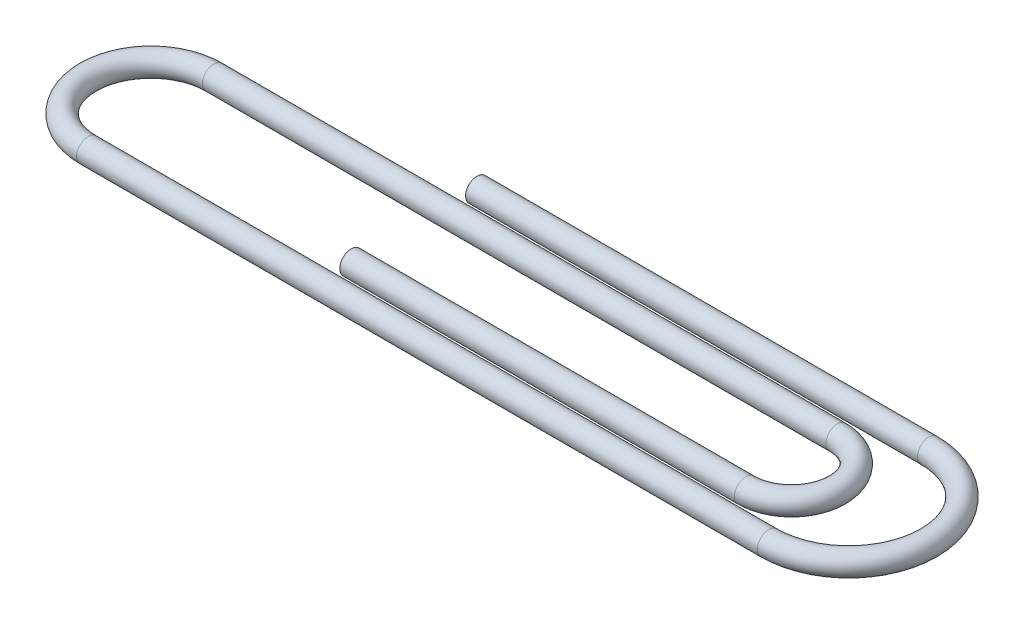
ISO-10303-21;
HEADER;
FILE_DESCRIPTION(('STEP AP214'),'2;1');
FILE_NAME('part.step','',(''),(''),'','','');
FILE_SCHEMA(('AUTOMOTIVE_DESIGN { 1 0 10303 214 1 1 1 1 }'));
ENDSEC;
DATA;
#1=APPLICATION_CONTEXT('core data for automotive mechanical design processes');
#2=APPLICATION_PROTOCOL_DEFINITION('international standard','automotive_design',2000,#1);
#3=PRODUCT_CONTEXT('',#1,'mechanical');
#4=PRODUCT('Part','Part','',(#3));
#5=PRODUCT_RELATED_PRODUCT_CATEGORY('part','',(#4));
#6=PRODUCT_DEFINITION_FORMATION('','',#4);
#7=PRODUCT_DEFINITION_CONTEXT('part definition',#1,'design');
#8=PRODUCT_DEFINITION('design','',#6,#7);
#9=PRODUCT_DEFINITION_SHAPE('','',#8);
#10=(LENGTH_UNIT() NAMED_UNIT(*) SI_UNIT(.MILLI.,.METRE.));
#11=(NAMED_UNIT(*) PLANE_ANGLE_UNIT() SI_UNIT($,.RADIAN.));
#12=(NAMED_UNIT(*) SI_UNIT($,.STERADIAN.) SOLID_ANGLE_UNIT());
#13=UNCERTAINTY_MEASURE_WITH_UNIT(LENGTH_MEASURE(1.E-05),#10,'distance_accuracy_value','');
#14=(GEOMETRIC_REPRESENTATION_CONTEXT(3) GLOBAL_UNCERTAINTY_ASSIGNED_CONTEXT((#13)) GLOBAL_UNIT_ASSIGNED_CONTEXT((#10,
#11,#12)) REPRESENTATION_CONTEXT('',''));
#15=CARTESIAN_POINT('',(0.,0.,0.));
#16=DIRECTION('',(0.,0.,1.));
#17=DIRECTION('',(1.,0.,0.));
#18=AXIS2_PLACEMENT_3D('',#15,#16,#17);
#19=CARTESIAN_POINT('',(0.,0.,0.));
#20=DIRECTION('',(-1.,0.,0.));
#21=DIRECTION('',(0.,0.,1.));
#22=AXIS2_PLACEMENT_3D('',#19,#20,#21);
#23=PLANE('',#22);
#24=CARTESIAN_POINT('',(0.,0.,0.));
#25=DIRECTION('',(-1.,0.,0.));
#26=DIRECTION('',(0.,0.,1.));
#27=AXIS2_PLACEMENT_3D('',#24,#25,#26);
#28=CIRCLE('',#27,0.5);
#29=CARTESIAN_POINT('',(0.,0.,0.5));
#30=VERTEX_POINT('',#29);
#31=EDGE_CURVE('E90',#30,#30,#28,.T.);
#32=ORIENTED_EDGE('',*,*,#31,.T.);
#33=EDGE_LOOP('',(#32));
#34=FACE_BOUND('',#33,.T.);
#35=ADVANCED_FACE('F55',(#34),#23,.T.);
#36=CARTESIAN_POINT('',(0.,0.,5.5));
#37=DIRECTION('',(1.,0.,0.));
#38=DIRECTION('',(0.,0.,-1.));
#39=AXIS2_PLACEMENT_3D('',#36,#37,#38);
#40=PLANE('',#39);
#41=CARTESIAN_POINT('',(0.,0.,5.5));
#42=DIRECTION('',(1.,0.,0.));
#43=DIRECTION('',(0.,0.,-1.));
#44=AXIS2_PLACEMENT_3D('',#41,#42,#43);
#45=CIRCLE('',#44,0.5);
#46=CARTESIAN_POINT('',(0.,0.,5.));
#47=VERTEX_POINT('',#46);
#48=EDGE_CURVE('E11',#47,#47,#45,.T.);
#49=ORIENTED_EDGE('',*,*,#48,.F.);
#50=EDGE_LOOP('',(#49));
#51=FACE_BOUND('',#50,.T.);
#52=ADVANCED_FACE('F99',(#51),#40,.F.);
#53=CARTESIAN_POINT('',(0.,0.,0.));
#54=DIRECTION('',(1.,0.,0.));
#55=DIRECTION('',(0.,0.,-1.));
#56=AXIS2_PLACEMENT_3D('',#53,#54,#55);
#57=CYLINDRICAL_SURFACE('',#56,0.5);
#58=CARTESIAN_POINT('',(19.75,0.,0.));
#59=DIRECTION('',(-1.,0.,0.));
#60=DIRECTION('',(0.,0.,1.));
#61=AXIS2_PLACEMENT_3D('',#58,#59,#60);
#62=CIRCLE('',#61,0.5);
#63=CARTESIAN_POINT('',(19.75,0.,-0.5));
#64=VERTEX_POINT('',#63);
#65=EDGE_CURVE('E86',#64,#64,#62,.T.);
#66=ORIENTED_EDGE('',*,*,#65,.T.);
#67=EDGE_LOOP('',(#66));
#68=FACE_BOUND('',#67,.T.);
#69=ORIENTED_EDGE('',*,*,#31,.F.);
#70=EDGE_LOOP('',(#69));
#71=FACE_BOUND('',#70,.T.);
#72=ADVANCED_FACE('F96',(#68,#71),#57,.T.);
#73=CARTESIAN_POINT('',(19.75,0.,3.5));
#74=DIRECTION('',(0.,-1.,0.));
#75=DIRECTION('',(0.,0.,-1.));
#76=AXIS2_PLACEMENT_3D('',#73,#74,#75);
#77=TOROIDAL_SURFACE('',#76,3.5,0.5);
#78=CARTESIAN_POINT('',(19.75,0.,7.00000000000001));
#79=DIRECTION('',(1.,0.,0.));
#80=DIRECTION('',(0.,0.,-1.));
#81=AXIS2_PLACEMENT_3D('',#78,#79,#80);
#82=CIRCLE('',#81,0.5);
#83=CARTESIAN_POINT('',(19.75,0.,7.50000000000001));
#84=VERTEX_POINT('',#83);
#85=EDGE_CURVE('E82',#84,#84,#82,.T.);
#86=CARTESIAN_POINT('',(19.75,0.,3.5));
#87=DIRECTION('',(0.,-1.,0.));
#88=DIRECTION('',(0.,0.,-1.));
#89=AXIS2_PLACEMENT_3D('',#86,#87,#88);
#90=CIRCLE('',#89,4.);
#91=EDGE_CURVE('',#64,#84,#90,.T.);
#92=ORIENTED_EDGE('',*,*,#65,.F.);
#93=ORIENTED_EDGE('',*,*,#85,.T.);
#94=ORIENTED_EDGE('',*,*,#91,.T.);
#95=ORIENTED_EDGE('',*,*,#91,.F.);
#96=EDGE_LOOP('',(#92,#94,#93,#95));
#97=FACE_BOUND('',#96,.T.);
#98=ADVANCED_FACE('F98',(#97),#77,.T.);
#99=CARTESIAN_POINT('',(19.75,0.,7.00000000000001));
#100=DIRECTION('',(-1.,0.,0.));
#101=DIRECTION('',(0.,0.,1.));
#102=AXIS2_PLACEMENT_3D('',#99,#100,#101);
#103=CYLINDRICAL_SURFACE('',#102,0.5);
#104=CARTESIAN_POINT('',(-10.,0.,7.));
#105=DIRECTION('',(1.,0.,0.));
#106=DIRECTION('',(0.,0.,-1.));
#107=AXIS2_PLACEMENT_3D('',#104,#105,#106);
#108=CIRCLE('',#107,0.5);
#109=CARTESIAN_POINT('',(-10.,0.,7.50000000000001));
#110=VERTEX_POINT('',#109);
#111=EDGE_CURVE('E78',#110,#110,#108,.T.);
#112=ORIENTED_EDGE('',*,*,#111,.T.);
#113=EDGE_LOOP('',(#112));
#114=FACE_BOUND('',#113,.T.);
#115=ORIENTED_EDGE('',*,*,#85,.F.);
#116=EDGE_LOOP('',(#115));
#117=FACE_BOUND('',#116,.T.);
#118=ADVANCED_FACE('F106',(#114,#117),#103,.T.);
#119=CARTESIAN_POINT('',(-10.,0.,4.25000000000001));
#120=DIRECTION('',(0.,-1.,0.));
#121=DIRECTION('',(0.,0.,-1.));
#122=AXIS2_PLACEMENT_3D('',#119,#120,#121);
#123=TOROIDAL_SURFACE('',#122,2.75,0.5);
#124=CARTESIAN_POINT('',(-10.,0.,1.5));
#125=DIRECTION('',(-1.,0.,0.));
#126=DIRECTION('',(0.,0.,1.));
#127=AXIS2_PLACEMENT_3D('',#124,#125,#126);
#128=CIRCLE('',#127,0.5);
#129=CARTESIAN_POINT('',(-10.,0.,1.));
#130=VERTEX_POINT('',#129);
#131=EDGE_CURVE('E72',#130,#130,#128,.T.);
#132=CARTESIAN_POINT('',(-10.,0.,4.25000000000001));
#133=DIRECTION('',(0.,-1.,0.));
#134=DIRECTION('',(0.,0.,-1.));
#135=AXIS2_PLACEMENT_3D('',#132,#133,#134);
#136=CIRCLE('',#135,3.25);
#137=EDGE_CURVE('',#110,#130,#136,.T.);
#138=ORIENTED_EDGE('',*,*,#111,.F.);
#139=ORIENTED_EDGE('',*,*,#131,.T.);
#140=ORIENTED_EDGE('',*,*,#137,.T.);
#141=ORIENTED_EDGE('',*,*,#137,.F.);
#142=EDGE_LOOP('',(#138,#140,#139,#141));
#143=FACE_BOUND('',#142,.T.);
#144=ADVANCED_FACE('F123',(#143),#123,.T.);
#145=CARTESIAN_POINT('',(-10.,0.,1.5));
#146=DIRECTION('',(1.,0.,0.));
#147=DIRECTION('',(0.,0.,-1.));
#148=AXIS2_PLACEMENT_3D('',#145,#146,#147);
#149=CYLINDRICAL_SURFACE('',#148,0.5);
#150=CARTESIAN_POINT('',(17.25,0.,1.49999999999999));
#151=DIRECTION('',(-1.,0.,0.));
#152=DIRECTION('',(0.,0.,1.));
#153=AXIS2_PLACEMENT_3D('',#150,#151,#152);
#154=CIRCLE('',#153,0.5);
#155=CARTESIAN_POINT('',(17.25,0.,0.999999999999993));
#156=VERTEX_POINT('',#155);
#157=EDGE_CURVE('E67',#156,#156,#154,.T.);
#158=ORIENTED_EDGE('',*,*,#157,.T.);
#159=EDGE_LOOP('',(#158));
#160=FACE_BOUND('',#159,.T.);
#161=ORIENTED_EDGE('',*,*,#131,.F.);
#162=EDGE_LOOP('',(#161));
#163=FACE_BOUND('',#162,.T.);
#164=ADVANCED_FACE('F117',(#160,#163),#149,.T.);
#165=CARTESIAN_POINT('',(17.25,0.,3.5));
#166=DIRECTION('',(0.,-1.,0.));
#167=DIRECTION('',(0.,0.,-1.));
#168=AXIS2_PLACEMENT_3D('',#165,#166,#167);
#169=TOROIDAL_SURFACE('',#168,2.,0.5);
#170=CARTESIAN_POINT('',(17.25,0.,5.5));
#171=DIRECTION('',(1.,0.,0.));
#172=DIRECTION('',(0.,0.,-1.));
#173=AXIS2_PLACEMENT_3D('',#170,#171,#172);
#174=CIRCLE('',#173,0.5);
#175=CARTESIAN_POINT('',(17.25,0.,6.));
#176=VERTEX_POINT('',#175);
#177=EDGE_CURVE('E62',#176,#176,#174,.T.);
#178=CARTESIAN_POINT('',(17.25,0.,3.5));
#179=DIRECTION('',(0.,-1.,0.));
#180=DIRECTION('',(0.,0.,-1.));
#181=AXIS2_PLACEMENT_3D('',#178,#179,#180);
#182=CIRCLE('',#181,2.5);
#183=EDGE_CURVE('',#156,#176,#182,.T.);
#184=ORIENTED_EDGE('',*,*,#157,.F.);
#185=ORIENTED_EDGE('',*,*,#177,.T.);
#186=ORIENTED_EDGE('',*,*,#183,.T.);
#187=ORIENTED_EDGE('',*,*,#183,.F.);
#188=EDGE_LOOP('',(#184,#186,#185,#187));
#189=FACE_BOUND('',#188,.T.);
#190=ADVANCED_FACE('F112',(#189),#169,.T.);
#191=CARTESIAN_POINT('',(17.25,0.,5.5));
#192=DIRECTION('',(-1.,0.,0.));
#193=DIRECTION('',(0.,0.,1.));
#194=AXIS2_PLACEMENT_3D('',#191,#192,#193);
#195=CYLINDRICAL_SURFACE('',#194,0.5);
#196=ORIENTED_EDGE('',*,*,#48,.T.);
#197=EDGE_LOOP('',(#196));
#198=FACE_BOUND('',#197,.T.);
#199=ORIENTED_EDGE('',*,*,#177,.F.);
#200=EDGE_LOOP('',(#199));
#201=FACE_BOUND('',#200,.T.);
#202=ADVANCED_FACE('F110',(#198,#201),#195,.T.);
#203=CLOSED_SHELL('',(#35,#52,#72,#98,#118,#144,#164,#190,#202));
#204=MANIFOLD_SOLID_BREP('B2',#203);
#205=ADVANCED_BREP_SHAPE_REPRESENTATION('',(#18,#204),#14);
#206=SHAPE_DEFINITION_REPRESENTATION(#9,#205);
ENDSEC;
END-ISO-10303-21;
